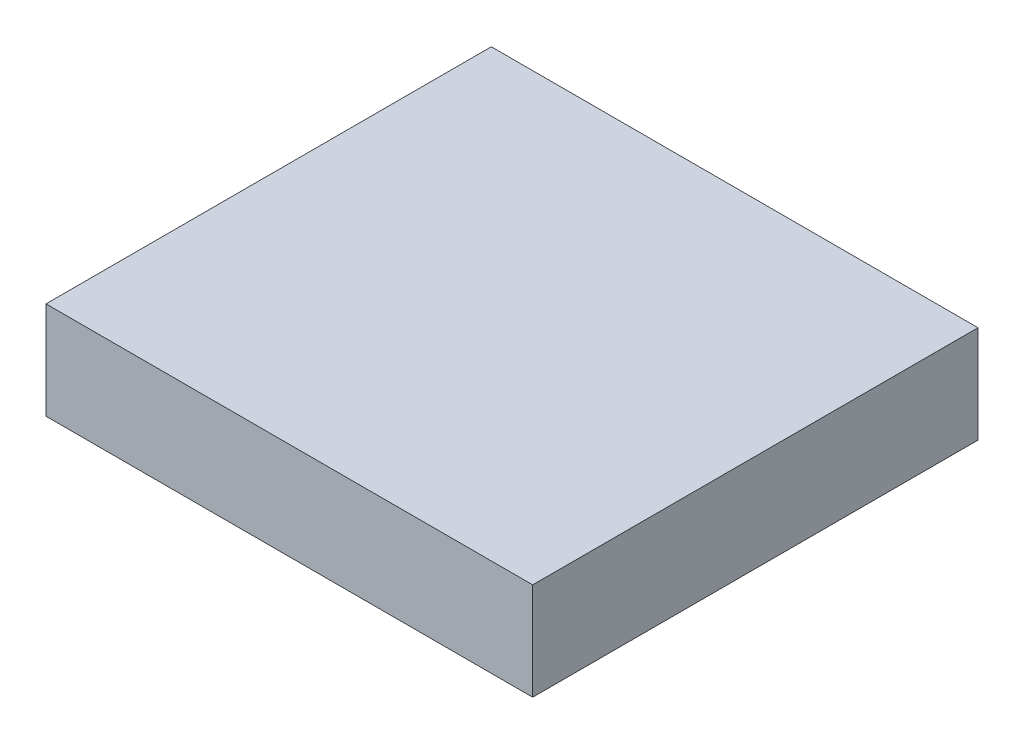
ISO-10303-21;
HEADER;
FILE_DESCRIPTION(('STEP AP214'),'2;1');
FILE_NAME('part.step','',(''),(''),'','','');
FILE_SCHEMA(('AUTOMOTIVE_DESIGN { 1 0 10303 214 1 1 1 1 }'));
ENDSEC;
DATA;
#1=APPLICATION_CONTEXT('core data for automotive mechanical design processes');
#2=APPLICATION_PROTOCOL_DEFINITION('international standard','automotive_design',2000,#1);
#3=PRODUCT_CONTEXT('',#1,'mechanical');
#4=PRODUCT('Part','Part','',(#3));
#5=PRODUCT_RELATED_PRODUCT_CATEGORY('part','',(#4));
#6=PRODUCT_DEFINITION_FORMATION('','',#4);
#7=PRODUCT_DEFINITION_CONTEXT('part definition',#1,'design');
#8=PRODUCT_DEFINITION('design','',#6,#7);
#9=PRODUCT_DEFINITION_SHAPE('','',#8);
#10=(LENGTH_UNIT() NAMED_UNIT(*) SI_UNIT(.MILLI.,.METRE.));
#11=(NAMED_UNIT(*) PLANE_ANGLE_UNIT() SI_UNIT($,.RADIAN.));
#12=(NAMED_UNIT(*) SI_UNIT($,.STERADIAN.) SOLID_ANGLE_UNIT());
#13=UNCERTAINTY_MEASURE_WITH_UNIT(LENGTH_MEASURE(1.E-05),#10,'distance_accuracy_value','');
#14=(GEOMETRIC_REPRESENTATION_CONTEXT(3) GLOBAL_UNCERTAINTY_ASSIGNED_CONTEXT((#13)) GLOBAL_UNIT_ASSIGNED_CONTEXT((#10,
#11,#12)) REPRESENTATION_CONTEXT('',''));
#15=CARTESIAN_POINT('',(0.,0.,0.));
#16=DIRECTION('',(0.,0.,1.));
#17=DIRECTION('',(1.,0.,0.));
#18=AXIS2_PLACEMENT_3D('',#15,#16,#17);
#19=CARTESIAN_POINT('',(10.,4.,9.15));
#20=DIRECTION('',(-1.,0.,0.));
#21=DIRECTION('',(0.,0.,1.));
#22=AXIS2_PLACEMENT_3D('',#19,#20,#21);
#23=PLANE('',#22);
#24=DIRECTION('',(0.,0.,-1.));
#25=VECTOR('',#24,1.);
#26=CARTESIAN_POINT('',(10.,0.,9.15));
#27=LINE('',#26,#25);
#28=CARTESIAN_POINT('',(10.,0.,9.15));
#29=VERTEX_POINT('',#28);
#30=CARTESIAN_POINT('',(10.,0.,-9.15));
#31=VERTEX_POINT('',#30);
#32=EDGE_CURVE('E111',#29,#31,#27,.T.);
#33=ORIENTED_EDGE('',*,*,#32,.T.);
#34=DIRECTION('',(0.,-1.,0.));
#35=VECTOR('',#34,1.);
#36=CARTESIAN_POINT('',(10.,4.,-9.15));
#37=LINE('',#36,#35);
#38=CARTESIAN_POINT('',(10.,4.,-9.15));
#39=VERTEX_POINT('',#38);
#40=EDGE_CURVE('E11',#39,#31,#37,.T.);
#41=ORIENTED_EDGE('',*,*,#40,.F.);
#42=DIRECTION('',(0.,0.,-1.));
#43=VECTOR('',#42,1.);
#44=CARTESIAN_POINT('',(10.,4.,9.15));
#45=LINE('',#44,#43);
#46=CARTESIAN_POINT('',(10.,4.,9.15));
#47=VERTEX_POINT('',#46);
#48=EDGE_CURVE('E95',#47,#39,#45,.T.);
#49=ORIENTED_EDGE('',*,*,#48,.F.);
#50=DIRECTION('',(0.,-1.,0.));
#51=VECTOR('',#50,1.);
#52=CARTESIAN_POINT('',(10.,4.,9.15));
#53=LINE('',#52,#51);
#54=EDGE_CURVE('E107',#47,#29,#53,.T.);
#55=ORIENTED_EDGE('',*,*,#54,.T.);
#56=EDGE_LOOP('',(#33,#41,#49,#55));
#57=FACE_BOUND('',#56,.T.);
#58=ADVANCED_FACE('F43',(#57),#23,.F.);
#59=CARTESIAN_POINT('',(-10.,4.,-9.15));
#60=DIRECTION('',(0.,0.,1.));
#61=DIRECTION('',(1.,0.,0.));
#62=AXIS2_PLACEMENT_3D('',#59,#60,#61);
#63=PLANE('',#62);
#64=DIRECTION('',(-1.,0.,0.));
#65=VECTOR('',#64,1.);
#66=CARTESIAN_POINT('',(-10.,0.,-9.15));
#67=LINE('',#66,#65);
#68=CARTESIAN_POINT('',(-10.,0.,-9.15));
#69=VERTEX_POINT('',#68);
#70=EDGE_CURVE('E100',#31,#69,#67,.T.);
#71=ORIENTED_EDGE('',*,*,#70,.T.);
#72=DIRECTION('',(0.,-1.,0.));
#73=VECTOR('',#72,1.);
#74=CARTESIAN_POINT('',(-10.,4.,-9.15));
#75=LINE('',#74,#73);
#76=CARTESIAN_POINT('',(-10.,4.,-9.15));
#77=VERTEX_POINT('',#76);
#78=EDGE_CURVE('E52',#77,#69,#75,.T.);
#79=ORIENTED_EDGE('',*,*,#78,.F.);
#80=DIRECTION('',(-1.,0.,0.));
#81=VECTOR('',#80,1.);
#82=CARTESIAN_POINT('',(-10.,4.,-9.15));
#83=LINE('',#82,#81);
#84=EDGE_CURVE('E90',#39,#77,#83,.T.);
#85=ORIENTED_EDGE('',*,*,#84,.F.);
#86=ORIENTED_EDGE('',*,*,#40,.T.);
#87=EDGE_LOOP('',(#71,#79,#85,#86));
#88=FACE_BOUND('',#87,.T.);
#89=ADVANCED_FACE('F99',(#88),#63,.F.);
#90=CARTESIAN_POINT('',(-10.,4.,9.15));
#91=DIRECTION('',(1.,0.,0.));
#92=DIRECTION('',(0.,0.,-1.));
#93=AXIS2_PLACEMENT_3D('',#90,#91,#92);
#94=PLANE('',#93);
#95=DIRECTION('',(0.,0.,1.));
#96=VECTOR('',#95,1.);
#97=CARTESIAN_POINT('',(-10.,0.,9.15));
#98=LINE('',#97,#96);
#99=CARTESIAN_POINT('',(-10.,0.,9.15));
#100=VERTEX_POINT('',#99);
#101=EDGE_CURVE('E77',#69,#100,#98,.T.);
#102=ORIENTED_EDGE('',*,*,#101,.T.);
#103=DIRECTION('',(0.,-1.,0.));
#104=VECTOR('',#103,1.);
#105=CARTESIAN_POINT('',(-10.,4.,9.15));
#106=LINE('',#105,#104);
#107=CARTESIAN_POINT('',(-10.,4.,9.15));
#108=VERTEX_POINT('',#107);
#109=EDGE_CURVE('E102',#108,#100,#106,.T.);
#110=ORIENTED_EDGE('',*,*,#109,.F.);
#111=DIRECTION('',(0.,0.,1.));
#112=VECTOR('',#111,1.);
#113=CARTESIAN_POINT('',(-10.,4.,9.15));
#114=LINE('',#113,#112);
#115=EDGE_CURVE('E93',#77,#108,#114,.T.);
#116=ORIENTED_EDGE('',*,*,#115,.F.);
#117=ORIENTED_EDGE('',*,*,#78,.T.);
#118=EDGE_LOOP('',(#102,#110,#116,#117));
#119=FACE_BOUND('',#118,.T.);
#120=ADVANCED_FACE('F103',(#119),#94,.F.);
#121=CARTESIAN_POINT('',(-10.,4.,9.15));
#122=DIRECTION('',(0.,0.,-1.));
#123=DIRECTION('',(-1.,0.,0.));
#124=AXIS2_PLACEMENT_3D('',#121,#122,#123);
#125=PLANE('',#124);
#126=DIRECTION('',(1.,0.,0.));
#127=VECTOR('',#126,1.);
#128=CARTESIAN_POINT('',(-10.,0.,9.15));
#129=LINE('',#128,#127);
#130=EDGE_CURVE('E83',#100,#29,#129,.T.);
#131=ORIENTED_EDGE('',*,*,#130,.T.);
#132=ORIENTED_EDGE('',*,*,#54,.F.);
#133=DIRECTION('',(1.,0.,0.));
#134=VECTOR('',#133,1.);
#135=CARTESIAN_POINT('',(-10.,4.,9.15));
#136=LINE('',#135,#134);
#137=EDGE_CURVE('E60',#108,#47,#136,.T.);
#138=ORIENTED_EDGE('',*,*,#137,.F.);
#139=ORIENTED_EDGE('',*,*,#109,.T.);
#140=EDGE_LOOP('',(#131,#132,#138,#139));
#141=FACE_BOUND('',#140,.T.);
#142=ADVANCED_FACE('F124',(#141),#125,.F.);
#143=CARTESIAN_POINT('',(0.,4.,0.));
#144=DIRECTION('',(0.,-1.,0.));
#145=DIRECTION('',(0.,0.,-1.));
#146=AXIS2_PLACEMENT_3D('',#143,#144,#145);
#147=PLANE('',#146);
#148=ORIENTED_EDGE('',*,*,#48,.T.);
#149=ORIENTED_EDGE('',*,*,#84,.T.);
#150=ORIENTED_EDGE('',*,*,#115,.T.);
#151=ORIENTED_EDGE('',*,*,#137,.T.);
#152=EDGE_LOOP('',(#148,#149,#150,#151));
#153=FACE_BOUND('',#152,.T.);
#154=ADVANCED_FACE('F91',(#153),#147,.F.);
#155=CARTESIAN_POINT('',(0.,0.,0.));
#156=DIRECTION('',(0.,-1.,0.));
#157=DIRECTION('',(0.,0.,-1.));
#158=AXIS2_PLACEMENT_3D('',#155,#156,#157);
#159=PLANE('',#158);
#160=ORIENTED_EDGE('',*,*,#32,.F.);
#161=ORIENTED_EDGE('',*,*,#130,.F.);
#162=ORIENTED_EDGE('',*,*,#101,.F.);
#163=ORIENTED_EDGE('',*,*,#70,.F.);
#164=EDGE_LOOP('',(#160,#161,#162,#163));
#165=FACE_BOUND('',#164,.T.);
#166=ADVANCED_FACE('F127',(#165),#159,.T.);
#167=CLOSED_SHELL('',(#58,#89,#120,#142,#154,#166));
#168=MANIFOLD_SOLID_BREP('B2',#167);
#169=ADVANCED_BREP_SHAPE_REPRESENTATION('',(#18,#168),#14);
#170=SHAPE_DEFINITION_REPRESENTATION(#9,#169);
ENDSEC;
END-ISO-10303-21;
